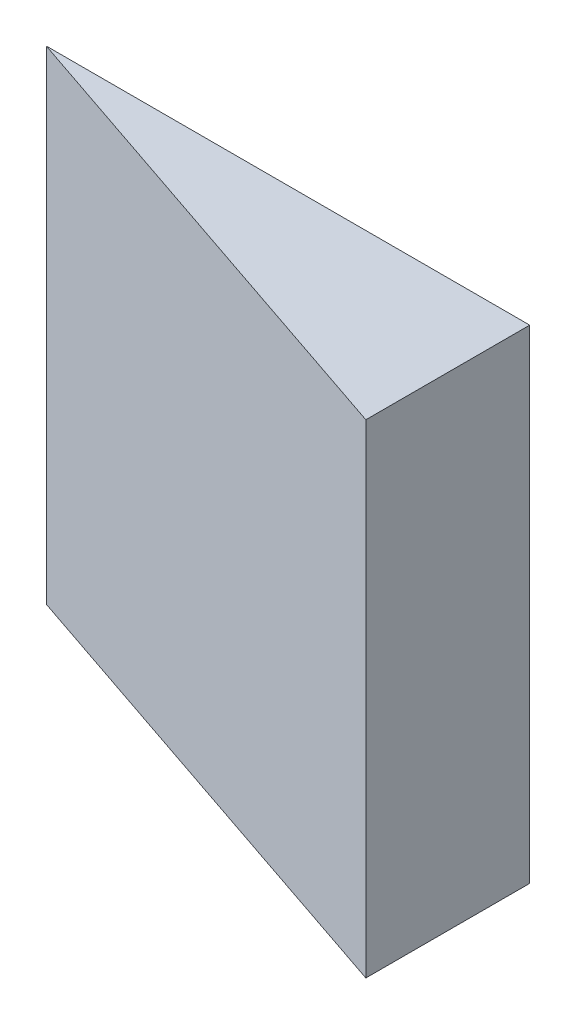
ISO-10303-21;
HEADER;
FILE_DESCRIPTION(('STEP AP214'),'2;1');
FILE_NAME('part.step','',(''),(''),'','','');
FILE_SCHEMA(('AUTOMOTIVE_DESIGN { 1 0 10303 214 1 1 1 1 }'));
ENDSEC;
DATA;
#1=APPLICATION_CONTEXT('core data for automotive mechanical design processes');
#2=APPLICATION_PROTOCOL_DEFINITION('international standard','automotive_design',2000,#1);
#3=PRODUCT_CONTEXT('',#1,'mechanical');
#4=PRODUCT('Part','Part','',(#3));
#5=PRODUCT_RELATED_PRODUCT_CATEGORY('part','',(#4));
#6=PRODUCT_DEFINITION_FORMATION('','',#4);
#7=PRODUCT_DEFINITION_CONTEXT('part definition',#1,'design');
#8=PRODUCT_DEFINITION('design','',#6,#7);
#9=PRODUCT_DEFINITION_SHAPE('','',#8);
#10=(LENGTH_UNIT() NAMED_UNIT(*) SI_UNIT(.MILLI.,.METRE.));
#11=(NAMED_UNIT(*) PLANE_ANGLE_UNIT() SI_UNIT($,.RADIAN.));
#12=(NAMED_UNIT(*) SI_UNIT($,.STERADIAN.) SOLID_ANGLE_UNIT());
#13=UNCERTAINTY_MEASURE_WITH_UNIT(LENGTH_MEASURE(1.E-05),#10,'distance_accuracy_value','');
#14=(GEOMETRIC_REPRESENTATION_CONTEXT(3) GLOBAL_UNCERTAINTY_ASSIGNED_CONTEXT((#13)) GLOBAL_UNIT_ASSIGNED_CONTEXT((#10,
#11,#12)) REPRESENTATION_CONTEXT('',''));
#15=CARTESIAN_POINT('',(0.,0.,0.));
#16=DIRECTION('',(0.,0.,1.));
#17=DIRECTION('',(1.,0.,0.));
#18=AXIS2_PLACEMENT_3D('',#15,#16,#17);
#19=CARTESIAN_POINT('',(-9.90288323187605,74.93,-34.1908451260969));
#20=DIRECTION('',(0.321039281157898,0.,-0.947065879415799));
#21=DIRECTION('',(-0.947065879415799,0.,-0.321039281157898));
#22=AXIS2_PLACEMENT_3D('',#19,#20,#21);
#23=PLANE('',#22);
#24=DIRECTION('',(0.947065879415799,0.,0.321039281157898));
#25=VECTOR('',#24,1.);
#26=CARTESIAN_POINT('',(-9.90288323187605,0.,-34.1908451260969));
#27=LINE('',#26,#25);
#28=CARTESIAN_POINT('',(-9.90288323187605,0.,-34.1908451260969));
#29=VERTEX_POINT('',#28);
#30=CARTESIAN_POINT('',(65.0271167681239,0.,-8.79084512609694));
#31=VERTEX_POINT('',#30);
#32=EDGE_CURVE('E80',#29,#31,#27,.T.);
#33=ORIENTED_EDGE('',*,*,#32,.T.);
#34=DIRECTION('',(0.,-1.,0.));
#35=VECTOR('',#34,1.);
#36=CARTESIAN_POINT('',(65.0271167681239,74.93,-8.79084512609694));
#37=LINE('',#36,#35);
#38=CARTESIAN_POINT('',(65.0271167681239,74.93,-8.79084512609694));
#39=VERTEX_POINT('',#38);
#40=EDGE_CURVE('E11',#39,#31,#37,.T.);
#41=ORIENTED_EDGE('',*,*,#40,.F.);
#42=DIRECTION('',(0.947065879415799,0.,0.321039281157898));
#43=VECTOR('',#42,1.);
#44=CARTESIAN_POINT('',(-9.90288323187605,74.93,-34.1908451260969));
#45=LINE('',#44,#43);
#46=CARTESIAN_POINT('',(-9.90288323187605,74.93,-34.1908451260969));
#47=VERTEX_POINT('',#46);
#48=EDGE_CURVE('E73',#47,#39,#45,.T.);
#49=ORIENTED_EDGE('',*,*,#48,.F.);
#50=DIRECTION('',(0.,-1.,0.));
#51=VECTOR('',#50,1.);
#52=CARTESIAN_POINT('',(-9.90288323187605,74.93,-34.1908451260969));
#53=LINE('',#52,#51);
#54=EDGE_CURVE('E81',#47,#29,#53,.T.);
#55=ORIENTED_EDGE('',*,*,#54,.T.);
#56=EDGE_LOOP('',(#33,#41,#49,#55));
#57=FACE_BOUND('',#56,.T.);
#58=ADVANCED_FACE('F33',(#57),#23,.F.);
#59=CARTESIAN_POINT('',(65.0271167681239,74.93,-34.1908451260969));
#60=DIRECTION('',(-1.,0.,0.));
#61=DIRECTION('',(0.,0.,1.));
#62=AXIS2_PLACEMENT_3D('',#59,#60,#61);
#63=PLANE('',#62);
#64=DIRECTION('',(0.,0.,-1.));
#65=VECTOR('',#64,1.);
#66=CARTESIAN_POINT('',(65.0271167681239,0.,-34.1908451260969));
#67=LINE('',#66,#65);
#68=CARTESIAN_POINT('',(65.0271167681239,0.,-34.1908451260969));
#69=VERTEX_POINT('',#68);
#70=EDGE_CURVE('E61',#31,#69,#67,.T.);
#71=ORIENTED_EDGE('',*,*,#70,.T.);
#72=DIRECTION('',(0.,-1.,0.));
#73=VECTOR('',#72,1.);
#74=CARTESIAN_POINT('',(65.0271167681239,74.93,-34.1908451260969));
#75=LINE('',#74,#73);
#76=CARTESIAN_POINT('',(65.0271167681239,74.93,-34.1908451260969));
#77=VERTEX_POINT('',#76);
#78=EDGE_CURVE('E41',#77,#69,#75,.T.);
#79=ORIENTED_EDGE('',*,*,#78,.F.);
#80=DIRECTION('',(0.,0.,-1.));
#81=VECTOR('',#80,1.);
#82=CARTESIAN_POINT('',(65.0271167681239,74.93,-34.1908451260969));
#83=LINE('',#82,#81);
#84=EDGE_CURVE('E69',#39,#77,#83,.T.);
#85=ORIENTED_EDGE('',*,*,#84,.F.);
#86=ORIENTED_EDGE('',*,*,#40,.T.);
#87=EDGE_LOOP('',(#71,#79,#85,#86));
#88=FACE_BOUND('',#87,.T.);
#89=ADVANCED_FACE('F70',(#88),#63,.F.);
#90=CARTESIAN_POINT('',(-9.90288323187605,74.93,-34.1908451260969));
#91=DIRECTION('',(0.,0.,1.));
#92=DIRECTION('',(1.,0.,0.));
#93=AXIS2_PLACEMENT_3D('',#90,#91,#92);
#94=PLANE('',#93);
#95=DIRECTION('',(-1.,0.,0.));
#96=VECTOR('',#95,1.);
#97=CARTESIAN_POINT('',(-9.90288323187605,0.,-34.1908451260969));
#98=LINE('',#97,#96);
#99=EDGE_CURVE('E66',#69,#29,#98,.T.);
#100=ORIENTED_EDGE('',*,*,#99,.T.);
#101=ORIENTED_EDGE('',*,*,#54,.F.);
#102=DIRECTION('',(-1.,0.,0.));
#103=VECTOR('',#102,1.);
#104=CARTESIAN_POINT('',(-9.90288323187605,74.93,-34.1908451260969));
#105=LINE('',#104,#103);
#106=EDGE_CURVE('E49',#77,#47,#105,.T.);
#107=ORIENTED_EDGE('',*,*,#106,.F.);
#108=ORIENTED_EDGE('',*,*,#78,.T.);
#109=EDGE_LOOP('',(#100,#101,#107,#108));
#110=FACE_BOUND('',#109,.T.);
#111=ADVANCED_FACE('F88',(#110),#94,.F.);
#112=CARTESIAN_POINT('',(0.,74.93,0.));
#113=DIRECTION('',(0.,-1.,0.));
#114=DIRECTION('',(0.,0.,-1.));
#115=AXIS2_PLACEMENT_3D('',#112,#113,#114);
#116=PLANE('',#115);
#117=ORIENTED_EDGE('',*,*,#48,.T.);
#118=ORIENTED_EDGE('',*,*,#84,.T.);
#119=ORIENTED_EDGE('',*,*,#106,.T.);
#120=EDGE_LOOP('',(#117,#118,#119));
#121=FACE_BOUND('',#120,.T.);
#122=ADVANCED_FACE('F76',(#121),#116,.F.);
#123=CARTESIAN_POINT('',(0.,0.,0.));
#124=DIRECTION('',(0.,-1.,0.));
#125=DIRECTION('',(0.,0.,-1.));
#126=AXIS2_PLACEMENT_3D('',#123,#124,#125);
#127=PLANE('',#126);
#128=ORIENTED_EDGE('',*,*,#32,.F.);
#129=ORIENTED_EDGE('',*,*,#99,.F.);
#130=ORIENTED_EDGE('',*,*,#70,.F.);
#131=EDGE_LOOP('',(#128,#129,#130));
#132=FACE_BOUND('',#131,.T.);
#133=ADVANCED_FACE('F89',(#132),#127,.T.);
#134=CLOSED_SHELL('',(#58,#89,#111,#122,#133));
#135=MANIFOLD_SOLID_BREP('B2',#134);
#136=ADVANCED_BREP_SHAPE_REPRESENTATION('',(#18,#135),#14);
#137=SHAPE_DEFINITION_REPRESENTATION(#9,#136);
ENDSEC;
END-ISO-10303-21;
